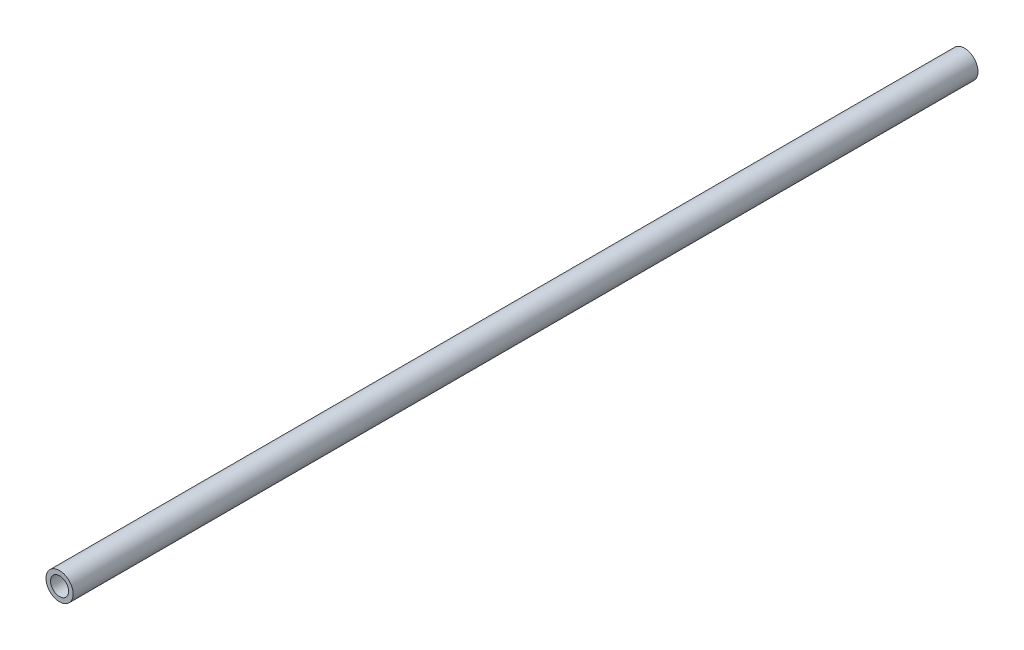
ISO-10303-21;
HEADER;
FILE_DESCRIPTION(('STEP AP214'),'2;1');
FILE_NAME('part.step','',(''),(''),'','','');
FILE_SCHEMA(('AUTOMOTIVE_DESIGN { 1 0 10303 214 1 1 1 1 }'));
ENDSEC;
DATA;
#1=APPLICATION_CONTEXT('core data for automotive mechanical design processes');
#2=APPLICATION_PROTOCOL_DEFINITION('international standard','automotive_design',2000,#1);
#3=PRODUCT_CONTEXT('',#1,'mechanical');
#4=PRODUCT('Part','Part','',(#3));
#5=PRODUCT_RELATED_PRODUCT_CATEGORY('part','',(#4));
#6=PRODUCT_DEFINITION_FORMATION('','',#4);
#7=PRODUCT_DEFINITION_CONTEXT('part definition',#1,'design');
#8=PRODUCT_DEFINITION('design','',#6,#7);
#9=PRODUCT_DEFINITION_SHAPE('','',#8);
#10=(LENGTH_UNIT() NAMED_UNIT(*) SI_UNIT(.MILLI.,.METRE.));
#11=(NAMED_UNIT(*) PLANE_ANGLE_UNIT() SI_UNIT($,.RADIAN.));
#12=(NAMED_UNIT(*) SI_UNIT($,.STERADIAN.) SOLID_ANGLE_UNIT());
#13=UNCERTAINTY_MEASURE_WITH_UNIT(LENGTH_MEASURE(1.E-05),#10,'distance_accuracy_value','');
#14=(GEOMETRIC_REPRESENTATION_CONTEXT(3) GLOBAL_UNCERTAINTY_ASSIGNED_CONTEXT((#13)) GLOBAL_UNIT_ASSIGNED_CONTEXT((#10,
#11,#12)) REPRESENTATION_CONTEXT('',''));
#15=CARTESIAN_POINT('',(0.,0.,0.));
#16=DIRECTION('',(0.,0.,1.));
#17=DIRECTION('',(1.,0.,0.));
#18=AXIS2_PLACEMENT_3D('',#15,#16,#17);
#19=CARTESIAN_POINT('',(0.,0.,500.));
#20=DIRECTION('',(0.,0.,1.));
#21=DIRECTION('',(1.,0.,0.));
#22=AXIS2_PLACEMENT_3D('',#19,#20,#21);
#23=PLANE('',#22);
#24=CARTESIAN_POINT('',(0.,0.,500.));
#25=DIRECTION('',(0.,0.,1.));
#26=DIRECTION('',(1.,0.,0.));
#27=AXIS2_PLACEMENT_3D('',#24,#25,#26);
#28=CIRCLE('',#27,7.5);
#29=CARTESIAN_POINT('',(7.5,0.,500.));
#30=VERTEX_POINT('',#29);
#31=EDGE_CURVE('E10',#30,#30,#28,.T.);
#32=ORIENTED_EDGE('',*,*,#31,.T.);
#33=EDGE_LOOP('',(#32));
#34=FACE_BOUND('',#33,.T.);
#35=CARTESIAN_POINT('',(0.,0.,500.));
#36=DIRECTION('',(0.,0.,1.));
#37=DIRECTION('',(1.,0.,0.));
#38=AXIS2_PLACEMENT_3D('',#35,#36,#37);
#39=CIRCLE('',#38,5.);
#40=CARTESIAN_POINT('',(5.,0.,500.));
#41=VERTEX_POINT('',#40);
#42=EDGE_CURVE('E56',#41,#41,#39,.T.);
#43=ORIENTED_EDGE('',*,*,#42,.F.);
#44=EDGE_LOOP('',(#43));
#45=FACE_BOUND('',#44,.T.);
#46=ADVANCED_FACE('F43',(#34,#45),#23,.T.);
#47=CARTESIAN_POINT('',(0.,0.,0.));
#48=DIRECTION('',(0.,0.,1.));
#49=DIRECTION('',(1.,0.,0.));
#50=AXIS2_PLACEMENT_3D('',#47,#48,#49);
#51=PLANE('',#50);
#52=CARTESIAN_POINT('',(0.,0.,0.));
#53=DIRECTION('',(0.,0.,1.));
#54=DIRECTION('',(1.,0.,0.));
#55=AXIS2_PLACEMENT_3D('',#52,#53,#54);
#56=CIRCLE('',#55,7.5);
#57=CARTESIAN_POINT('',(7.5,0.,0.));
#58=VERTEX_POINT('',#57);
#59=EDGE_CURVE('E47',#58,#58,#56,.T.);
#60=ORIENTED_EDGE('',*,*,#59,.F.);
#61=EDGE_LOOP('',(#60));
#62=FACE_BOUND('',#61,.T.);
#63=CARTESIAN_POINT('',(0.,0.,0.));
#64=DIRECTION('',(0.,0.,1.));
#65=DIRECTION('',(1.,0.,0.));
#66=AXIS2_PLACEMENT_3D('',#63,#64,#65);
#67=CIRCLE('',#66,5.);
#68=CARTESIAN_POINT('',(5.,0.,0.));
#69=VERTEX_POINT('',#68);
#70=EDGE_CURVE('E58',#69,#69,#67,.T.);
#71=ORIENTED_EDGE('',*,*,#70,.T.);
#72=EDGE_LOOP('',(#71));
#73=FACE_BOUND('',#72,.T.);
#74=ADVANCED_FACE('F70',(#62,#73),#51,.F.);
#75=CARTESIAN_POINT('',(0.,0.,500.));
#76=DIRECTION('',(0.,0.,-1.));
#77=DIRECTION('',(-1.,0.,0.));
#78=AXIS2_PLACEMENT_3D('',#75,#76,#77);
#79=CYLINDRICAL_SURFACE('',#78,7.5);
#80=ORIENTED_EDGE('',*,*,#31,.F.);
#81=EDGE_LOOP('',(#80));
#82=FACE_BOUND('',#81,.T.);
#83=ORIENTED_EDGE('',*,*,#59,.T.);
#84=EDGE_LOOP('',(#83));
#85=FACE_BOUND('',#84,.T.);
#86=ADVANCED_FACE('F45',(#82,#85),#79,.T.);
#87=CARTESIAN_POINT('',(0.,0.,500.));
#88=DIRECTION('',(0.,0.,-1.));
#89=DIRECTION('',(-1.,0.,0.));
#90=AXIS2_PLACEMENT_3D('',#87,#88,#89);
#91=CYLINDRICAL_SURFACE('',#90,5.);
#92=ORIENTED_EDGE('',*,*,#42,.T.);
#93=EDGE_LOOP('',(#92));
#94=FACE_BOUND('',#93,.T.);
#95=ORIENTED_EDGE('',*,*,#70,.F.);
#96=EDGE_LOOP('',(#95));
#97=FACE_BOUND('',#96,.T.);
#98=ADVANCED_FACE('F66',(#94,#97),#91,.F.);
#99=CLOSED_SHELL('',(#46,#74,#86,#98));
#100=MANIFOLD_SOLID_BREP('B2',#99);
#101=ADVANCED_BREP_SHAPE_REPRESENTATION('',(#18,#100),#14);
#102=SHAPE_DEFINITION_REPRESENTATION(#9,#101);
ENDSEC;
END-ISO-10303-21;
